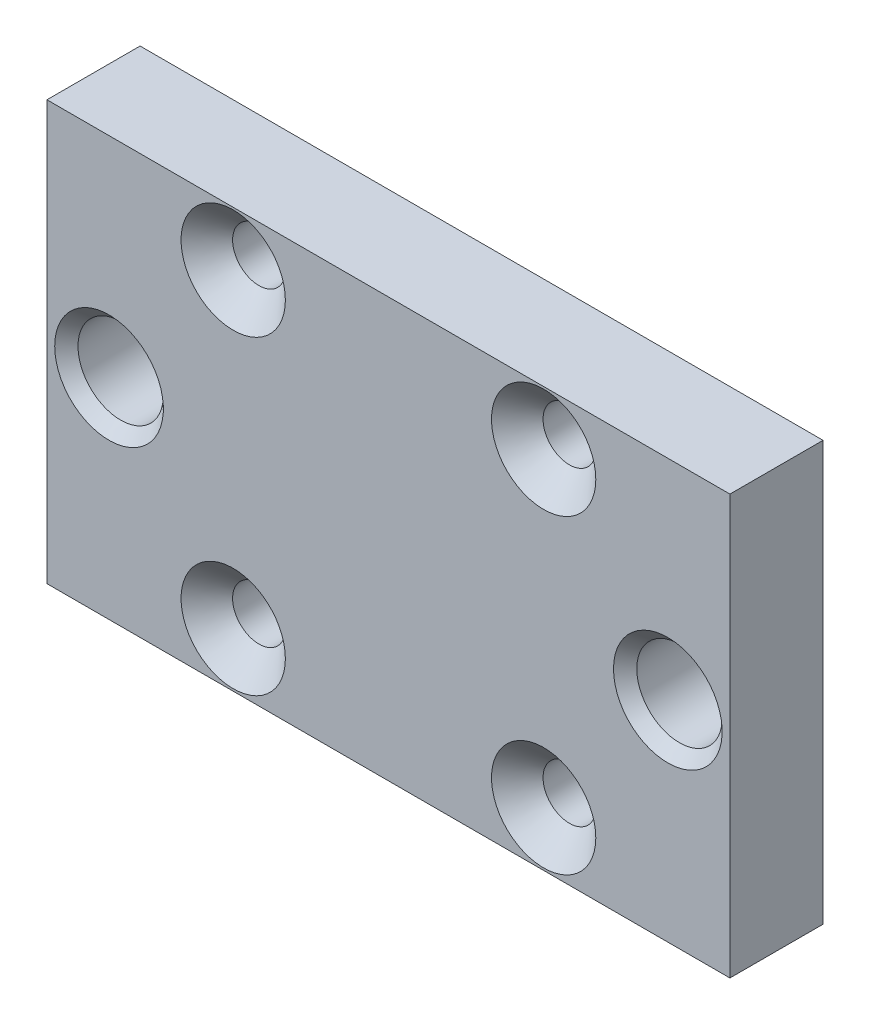
ISO-10303-21;
HEADER;
FILE_DESCRIPTION(('STEP AP214'),'2;1');
FILE_NAME('part.step','',(''),(''),'','','');
FILE_SCHEMA(('AUTOMOTIVE_DESIGN { 1 0 10303 214 1 1 1 1 }'));
ENDSEC;
DATA;
#1=APPLICATION_CONTEXT('core data for automotive mechanical design processes');
#2=APPLICATION_PROTOCOL_DEFINITION('international standard','automotive_design',2000,#1);
#3=PRODUCT_CONTEXT('',#1,'mechanical');
#4=PRODUCT('Part','Part','',(#3));
#5=PRODUCT_RELATED_PRODUCT_CATEGORY('part','',(#4));
#6=PRODUCT_DEFINITION_FORMATION('','',#4);
#7=PRODUCT_DEFINITION_CONTEXT('part definition',#1,'design');
#8=PRODUCT_DEFINITION('design','',#6,#7);
#9=PRODUCT_DEFINITION_SHAPE('','',#8);
#10=(LENGTH_UNIT() NAMED_UNIT(*) SI_UNIT(.MILLI.,.METRE.));
#11=(NAMED_UNIT(*) PLANE_ANGLE_UNIT() SI_UNIT($,.RADIAN.));
#12=(NAMED_UNIT(*) SI_UNIT($,.STERADIAN.) SOLID_ANGLE_UNIT());
#13=UNCERTAINTY_MEASURE_WITH_UNIT(LENGTH_MEASURE(1.E-05),#10,'distance_accuracy_value','');
#14=(GEOMETRIC_REPRESENTATION_CONTEXT(3) GLOBAL_UNCERTAINTY_ASSIGNED_CONTEXT((#13)) GLOBAL_UNIT_ASSIGNED_CONTEXT((#10,
#11,#12)) REPRESENTATION_CONTEXT('',''));
#15=CARTESIAN_POINT('',(0.,0.,0.));
#16=DIRECTION('',(0.,0.,1.));
#17=DIRECTION('',(1.,0.,0.));
#18=AXIS2_PLACEMENT_3D('',#15,#16,#17);
#19=CARTESIAN_POINT('',(0.,0.,6.));
#20=DIRECTION('',(0.,0.,-1.));
#21=DIRECTION('',(-1.,0.,0.));
#22=AXIS2_PLACEMENT_3D('',#19,#20,#21);
#23=PLANE('',#22);
#24=CARTESIAN_POINT('',(18.,0.,6.));
#25=DIRECTION('',(0.,0.,-1.));
#26=DIRECTION('',(-1.,0.,0.));
#27=AXIS2_PLACEMENT_3D('',#24,#25,#26);
#28=CIRCLE('',#27,3.5);
#29=CARTESIAN_POINT('',(14.5,0.,6.));
#30=VERTEX_POINT('',#29);
#31=EDGE_CURVE('E43',#30,#30,#28,.T.);
#32=ORIENTED_EDGE('',*,*,#31,.T.);
#33=EDGE_LOOP('',(#32));
#34=FACE_BOUND('',#33,.T.);
#35=CARTESIAN_POINT('',(-18.,0.,6.));
#36=DIRECTION('',(0.,0.,-1.));
#37=DIRECTION('',(-1.,0.,0.));
#38=AXIS2_PLACEMENT_3D('',#35,#36,#37);
#39=CIRCLE('',#38,3.5);
#40=CARTESIAN_POINT('',(-21.5,0.,6.));
#41=VERTEX_POINT('',#40);
#42=EDGE_CURVE('E114',#41,#41,#39,.T.);
#43=ORIENTED_EDGE('',*,*,#42,.T.);
#44=EDGE_LOOP('',(#43));
#45=FACE_BOUND('',#44,.T.);
#46=CARTESIAN_POINT('',(-10.,10.,6.));
#47=DIRECTION('',(0.,0.,1.));
#48=DIRECTION('',(1.,0.,0.));
#49=AXIS2_PLACEMENT_3D('',#46,#47,#48);
#50=CIRCLE('',#49,3.36);
#51=CARTESIAN_POINT('',(-6.64,10.,6.));
#52=VERTEX_POINT('',#51);
#53=EDGE_CURVE('E174',#52,#52,#50,.T.);
#54=ORIENTED_EDGE('',*,*,#53,.F.);
#55=EDGE_LOOP('',(#54));
#56=FACE_BOUND('',#55,.T.);
#57=CARTESIAN_POINT('',(10.,10.,6.));
#58=DIRECTION('',(0.,0.,1.));
#59=DIRECTION('',(1.,0.,0.));
#60=AXIS2_PLACEMENT_3D('',#57,#58,#59);
#61=CIRCLE('',#60,3.36);
#62=CARTESIAN_POINT('',(13.36,10.,6.));
#63=VERTEX_POINT('',#62);
#64=EDGE_CURVE('E165',#63,#63,#61,.T.);
#65=ORIENTED_EDGE('',*,*,#64,.F.);
#66=EDGE_LOOP('',(#65));
#67=FACE_BOUND('',#66,.T.);
#68=CARTESIAN_POINT('',(10.,-9.99999999999999,6.));
#69=DIRECTION('',(0.,0.,1.));
#70=DIRECTION('',(1.,0.,0.));
#71=AXIS2_PLACEMENT_3D('',#68,#69,#70);
#72=CIRCLE('',#71,3.36);
#73=CARTESIAN_POINT('',(13.36,-9.99999999999999,6.));
#74=VERTEX_POINT('',#73);
#75=EDGE_CURVE('E156',#74,#74,#72,.T.);
#76=ORIENTED_EDGE('',*,*,#75,.F.);
#77=EDGE_LOOP('',(#76));
#78=FACE_BOUND('',#77,.T.);
#79=CARTESIAN_POINT('',(-10.,-10.,6.));
#80=DIRECTION('',(0.,0.,1.));
#81=DIRECTION('',(1.,0.,0.));
#82=AXIS2_PLACEMENT_3D('',#79,#80,#81);
#83=CIRCLE('',#82,3.36);
#84=CARTESIAN_POINT('',(-6.64,-10.,6.));
#85=VERTEX_POINT('',#84);
#86=EDGE_CURVE('E147',#85,#85,#83,.T.);
#87=ORIENTED_EDGE('',*,*,#86,.F.);
#88=EDGE_LOOP('',(#87));
#89=FACE_BOUND('',#88,.T.);
#90=DIRECTION('',(0.,-1.,0.));
#91=VECTOR('',#90,1.);
#92=CARTESIAN_POINT('',(-22.,13.5,6.));
#93=LINE('',#92,#91);
#94=CARTESIAN_POINT('',(-22.,13.5,6.));
#95=VERTEX_POINT('',#94);
#96=CARTESIAN_POINT('',(-22.,-13.5,6.));
#97=VERTEX_POINT('',#96);
#98=EDGE_CURVE('E86',#95,#97,#93,.T.);
#99=ORIENTED_EDGE('',*,*,#98,.T.);
#100=DIRECTION('',(1.,0.,0.));
#101=VECTOR('',#100,1.);
#102=CARTESIAN_POINT('',(22.,-13.5,6.));
#103=LINE('',#102,#101);
#104=CARTESIAN_POINT('',(22.,-13.5,6.));
#105=VERTEX_POINT('',#104);
#106=EDGE_CURVE('E82',#97,#105,#103,.T.);
#107=ORIENTED_EDGE('',*,*,#106,.T.);
#108=DIRECTION('',(0.,1.,0.));
#109=VECTOR('',#108,1.);
#110=CARTESIAN_POINT('',(22.,13.5,6.));
#111=LINE('',#110,#109);
#112=CARTESIAN_POINT('',(22.,13.5,6.));
#113=VERTEX_POINT('',#112);
#114=EDGE_CURVE('E84',#105,#113,#111,.T.);
#115=ORIENTED_EDGE('',*,*,#114,.T.);
#116=DIRECTION('',(-1.,0.,0.));
#117=VECTOR('',#116,1.);
#118=CARTESIAN_POINT('',(22.,13.5,6.));
#119=LINE('',#118,#117);
#120=EDGE_CURVE('E51',#113,#95,#119,.T.);
#121=ORIENTED_EDGE('',*,*,#120,.T.);
#122=EDGE_LOOP('',(#99,#107,#115,#121));
#123=FACE_BOUND('',#122,.T.);
#124=ADVANCED_FACE('F34',(#34,#45,#56,#67,#78,#89,#123),#23,.F.);
#125=CARTESIAN_POINT('',(0.,0.,0.));
#126=DIRECTION('',(0.,0.,-1.));
#127=DIRECTION('',(-1.,0.,0.));
#128=AXIS2_PLACEMENT_3D('',#125,#126,#127);
#129=PLANE('',#128);
#130=CARTESIAN_POINT('',(-10.,10.,0.));
#131=DIRECTION('',(0.,0.,1.));
#132=DIRECTION('',(1.,0.,0.));
#133=AXIS2_PLACEMENT_3D('',#130,#131,#132);
#134=CIRCLE('',#133,1.7);
#135=CARTESIAN_POINT('',(-8.30000000000001,10.,0.));
#136=VERTEX_POINT('',#135);
#137=EDGE_CURVE('E168',#136,#136,#134,.T.);
#138=ORIENTED_EDGE('',*,*,#137,.T.);
#139=EDGE_LOOP('',(#138));
#140=FACE_BOUND('',#139,.T.);
#141=CARTESIAN_POINT('',(10.,10.,0.));
#142=DIRECTION('',(0.,0.,1.));
#143=DIRECTION('',(1.,0.,0.));
#144=AXIS2_PLACEMENT_3D('',#141,#142,#143);
#145=CIRCLE('',#144,1.7);
#146=CARTESIAN_POINT('',(11.7,10.,0.));
#147=VERTEX_POINT('',#146);
#148=EDGE_CURVE('E159',#147,#147,#145,.T.);
#149=ORIENTED_EDGE('',*,*,#148,.T.);
#150=EDGE_LOOP('',(#149));
#151=FACE_BOUND('',#150,.T.);
#152=CARTESIAN_POINT('',(10.,-9.99999999999999,0.));
#153=DIRECTION('',(0.,0.,1.));
#154=DIRECTION('',(1.,0.,0.));
#155=AXIS2_PLACEMENT_3D('',#152,#153,#154);
#156=CIRCLE('',#155,1.7);
#157=CARTESIAN_POINT('',(11.7,-9.99999999999999,0.));
#158=VERTEX_POINT('',#157);
#159=EDGE_CURVE('E150',#158,#158,#156,.T.);
#160=ORIENTED_EDGE('',*,*,#159,.T.);
#161=EDGE_LOOP('',(#160));
#162=FACE_BOUND('',#161,.T.);
#163=CARTESIAN_POINT('',(-10.,-10.,0.));
#164=DIRECTION('',(0.,0.,1.));
#165=DIRECTION('',(1.,0.,0.));
#166=AXIS2_PLACEMENT_3D('',#163,#164,#165);
#167=CIRCLE('',#166,1.7);
#168=CARTESIAN_POINT('',(-8.3,-10.,0.));
#169=VERTEX_POINT('',#168);
#170=EDGE_CURVE('E137',#169,#169,#167,.T.);
#171=ORIENTED_EDGE('',*,*,#170,.T.);
#172=EDGE_LOOP('',(#171));
#173=FACE_BOUND('',#172,.T.);
#174=CARTESIAN_POINT('',(-18.,0.,0.));
#175=DIRECTION('',(0.,0.,1.));
#176=DIRECTION('',(1.,0.,0.));
#177=AXIS2_PLACEMENT_3D('',#174,#175,#176);
#178=CIRCLE('',#177,2.75);
#179=CARTESIAN_POINT('',(-15.25,0.,0.));
#180=VERTEX_POINT('',#179);
#181=EDGE_CURVE('E104',#180,#180,#178,.T.);
#182=ORIENTED_EDGE('',*,*,#181,.T.);
#183=EDGE_LOOP('',(#182));
#184=FACE_BOUND('',#183,.T.);
#185=DIRECTION('',(0.,-1.,0.));
#186=VECTOR('',#185,1.);
#187=CARTESIAN_POINT('',(-22.,13.5,0.));
#188=LINE('',#187,#186);
#189=CARTESIAN_POINT('',(-22.,13.5,0.));
#190=VERTEX_POINT('',#189);
#191=CARTESIAN_POINT('',(-22.,-13.5,0.));
#192=VERTEX_POINT('',#191);
#193=EDGE_CURVE('E101',#190,#192,#188,.T.);
#194=ORIENTED_EDGE('',*,*,#193,.F.);
#195=DIRECTION('',(-1.,0.,0.));
#196=VECTOR('',#195,1.);
#197=CARTESIAN_POINT('',(22.,13.5,0.));
#198=LINE('',#197,#196);
#199=CARTESIAN_POINT('',(22.,13.5,0.));
#200=VERTEX_POINT('',#199);
#201=EDGE_CURVE('E74',#200,#190,#198,.T.);
#202=ORIENTED_EDGE('',*,*,#201,.F.);
#203=DIRECTION('',(0.,1.,0.));
#204=VECTOR('',#203,1.);
#205=CARTESIAN_POINT('',(22.,13.5,0.));
#206=LINE('',#205,#204);
#207=CARTESIAN_POINT('',(22.,-13.5,0.));
#208=VERTEX_POINT('',#207);
#209=EDGE_CURVE('E68',#208,#200,#206,.T.);
#210=ORIENTED_EDGE('',*,*,#209,.F.);
#211=DIRECTION('',(1.,0.,0.));
#212=VECTOR('',#211,1.);
#213=CARTESIAN_POINT('',(22.,-13.5,0.));
#214=LINE('',#213,#212);
#215=EDGE_CURVE('E91',#192,#208,#214,.T.);
#216=ORIENTED_EDGE('',*,*,#215,.F.);
#217=EDGE_LOOP('',(#194,#202,#210,#216));
#218=FACE_BOUND('',#217,.T.);
#219=CARTESIAN_POINT('',(18.,0.,0.));
#220=DIRECTION('',(0.,0.,1.));
#221=DIRECTION('',(1.,0.,0.));
#222=AXIS2_PLACEMENT_3D('',#219,#220,#221);
#223=CIRCLE('',#222,2.75);
#224=CARTESIAN_POINT('',(20.75,0.,0.));
#225=VERTEX_POINT('',#224);
#226=EDGE_CURVE('E135',#225,#225,#223,.T.);
#227=ORIENTED_EDGE('',*,*,#226,.T.);
#228=EDGE_LOOP('',(#227));
#229=FACE_BOUND('',#228,.T.);
#230=ADVANCED_FACE('F181',(#140,#151,#162,#173,#184,#218,#229),#129,.T.);
#231=CARTESIAN_POINT('',(-22.,13.5,6.));
#232=DIRECTION('',(1.,0.,0.));
#233=DIRECTION('',(0.,1.,0.));
#234=AXIS2_PLACEMENT_3D('',#231,#232,#233);
#235=PLANE('',#234);
#236=ORIENTED_EDGE('',*,*,#193,.T.);
#237=DIRECTION('',(0.,0.,-1.));
#238=VECTOR('',#237,1.);
#239=CARTESIAN_POINT('',(-22.,-13.5,6.));
#240=LINE('',#239,#238);
#241=EDGE_CURVE('E92',#97,#192,#240,.T.);
#242=ORIENTED_EDGE('',*,*,#241,.F.);
#243=ORIENTED_EDGE('',*,*,#98,.F.);
#244=DIRECTION('',(0.,0.,-1.));
#245=VECTOR('',#244,1.);
#246=CARTESIAN_POINT('',(-22.,13.5,6.));
#247=LINE('',#246,#245);
#248=EDGE_CURVE('E97',#95,#190,#247,.T.);
#249=ORIENTED_EDGE('',*,*,#248,.T.);
#250=EDGE_LOOP('',(#236,#242,#243,#249));
#251=FACE_BOUND('',#250,.T.);
#252=ADVANCED_FACE('F212',(#251),#235,.F.);
#253=CARTESIAN_POINT('',(22.,-13.5,6.));
#254=DIRECTION('',(0.,1.,0.));
#255=DIRECTION('',(-1.,0.,0.));
#256=AXIS2_PLACEMENT_3D('',#253,#254,#255);
#257=PLANE('',#256);
#258=ORIENTED_EDGE('',*,*,#215,.T.);
#259=DIRECTION('',(0.,0.,-1.));
#260=VECTOR('',#259,1.);
#261=CARTESIAN_POINT('',(22.,-13.5,6.));
#262=LINE('',#261,#260);
#263=EDGE_CURVE('E89',#105,#208,#262,.T.);
#264=ORIENTED_EDGE('',*,*,#263,.F.);
#265=ORIENTED_EDGE('',*,*,#106,.F.);
#266=ORIENTED_EDGE('',*,*,#241,.T.);
#267=EDGE_LOOP('',(#258,#264,#265,#266));
#268=FACE_BOUND('',#267,.T.);
#269=ADVANCED_FACE('F90',(#268),#257,.F.);
#270=CARTESIAN_POINT('',(22.,13.5,6.));
#271=DIRECTION('',(-1.,0.,0.));
#272=DIRECTION('',(0.,0.,1.));
#273=AXIS2_PLACEMENT_3D('',#270,#271,#272);
#274=PLANE('',#273);
#275=ORIENTED_EDGE('',*,*,#209,.T.);
#276=DIRECTION('',(0.,0.,-1.));
#277=VECTOR('',#276,1.);
#278=CARTESIAN_POINT('',(22.,13.5,6.));
#279=LINE('',#278,#277);
#280=EDGE_CURVE('E93',#113,#200,#279,.T.);
#281=ORIENTED_EDGE('',*,*,#280,.F.);
#282=ORIENTED_EDGE('',*,*,#114,.F.);
#283=ORIENTED_EDGE('',*,*,#263,.T.);
#284=EDGE_LOOP('',(#275,#281,#282,#283));
#285=FACE_BOUND('',#284,.T.);
#286=ADVANCED_FACE('F95',(#285),#274,.F.);
#287=CARTESIAN_POINT('',(22.,13.5,6.));
#288=DIRECTION('',(0.,-1.,0.));
#289=DIRECTION('',(1.,0.,0.));
#290=AXIS2_PLACEMENT_3D('',#287,#288,#289);
#291=PLANE('',#290);
#292=ORIENTED_EDGE('',*,*,#201,.T.);
#293=ORIENTED_EDGE('',*,*,#248,.F.);
#294=ORIENTED_EDGE('',*,*,#120,.F.);
#295=ORIENTED_EDGE('',*,*,#280,.T.);
#296=EDGE_LOOP('',(#292,#293,#294,#295));
#297=FACE_BOUND('',#296,.T.);
#298=ADVANCED_FACE('F207',(#297),#291,.F.);
#299=CARTESIAN_POINT('',(-18.,0.,6.));
#300=DIRECTION('',(0.,0.,-1.));
#301=DIRECTION('',(-1.,0.,0.));
#302=AXIS2_PLACEMENT_3D('',#299,#300,#301);
#303=CYLINDRICAL_SURFACE('',#302,2.75);
#304=CARTESIAN_POINT('',(-18.,0.,5.25));
#305=DIRECTION('',(0.,0.,-1.));
#306=DIRECTION('',(-1.,0.,0.));
#307=AXIS2_PLACEMENT_3D('',#304,#305,#306);
#308=CIRCLE('',#307,2.75);
#309=CARTESIAN_POINT('',(-20.75,0.,5.25));
#310=VERTEX_POINT('',#309);
#311=EDGE_CURVE('E11',#310,#310,#308,.F.);
#312=ORIENTED_EDGE('',*,*,#311,.T.);
#313=EDGE_LOOP('',(#312));
#314=FACE_BOUND('',#313,.T.);
#315=ORIENTED_EDGE('',*,*,#181,.F.);
#316=EDGE_LOOP('',(#315));
#317=FACE_BOUND('',#316,.T.);
#318=ADVANCED_FACE('F131',(#314,#317),#303,.F.);
#319=CARTESIAN_POINT('',(18.,0.,6.));
#320=DIRECTION('',(0.,0.,-1.));
#321=DIRECTION('',(-1.,0.,0.));
#322=AXIS2_PLACEMENT_3D('',#319,#320,#321);
#323=CYLINDRICAL_SURFACE('',#322,2.75);
#324=CARTESIAN_POINT('',(18.,0.,5.25));
#325=DIRECTION('',(0.,0.,-1.));
#326=DIRECTION('',(-1.,0.,0.));
#327=AXIS2_PLACEMENT_3D('',#324,#325,#326);
#328=CIRCLE('',#327,2.75);
#329=CARTESIAN_POINT('',(15.25,0.,5.25));
#330=VERTEX_POINT('',#329);
#331=EDGE_CURVE('E111',#330,#330,#328,.F.);
#332=ORIENTED_EDGE('',*,*,#331,.T.);
#333=EDGE_LOOP('',(#332));
#334=FACE_BOUND('',#333,.T.);
#335=ORIENTED_EDGE('',*,*,#226,.F.);
#336=EDGE_LOOP('',(#335));
#337=FACE_BOUND('',#336,.T.);
#338=ADVANCED_FACE('F127',(#334,#337),#323,.F.);
#339=CARTESIAN_POINT('',(-10.,-10.,6.));
#340=DIRECTION('',(0.,0.,1.));
#341=DIRECTION('',(1.,0.,0.));
#342=AXIS2_PLACEMENT_3D('',#339,#340,#341);
#343=CYLINDRICAL_SURFACE('',#342,1.7);
#344=ORIENTED_EDGE('',*,*,#170,.F.);
#345=EDGE_LOOP('',(#344));
#346=FACE_BOUND('',#345,.T.);
#347=CARTESIAN_POINT('',(-10.,-10.,4.34));
#348=DIRECTION('',(0.,0.,1.));
#349=DIRECTION('',(1.,0.,0.));
#350=AXIS2_PLACEMENT_3D('',#347,#348,#349);
#351=CIRCLE('',#350,1.7);
#352=CARTESIAN_POINT('',(-8.3,-10.,4.34));
#353=VERTEX_POINT('',#352);
#354=EDGE_CURVE('E142',#353,#353,#351,.T.);
#355=ORIENTED_EDGE('',*,*,#354,.T.);
#356=EDGE_LOOP('',(#355));
#357=FACE_BOUND('',#356,.T.);
#358=ADVANCED_FACE('F130',(#346,#357),#343,.F.);
#359=CARTESIAN_POINT('',(-10.,-10.,6.));
#360=DIRECTION('',(0.,0.,1.));
#361=DIRECTION('',(1.,0.,0.));
#362=AXIS2_PLACEMENT_3D('',#359,#360,#361);
#363=CONICAL_SURFACE('',#362,3.36,0.785398163397449);
#364=ORIENTED_EDGE('',*,*,#354,.F.);
#365=EDGE_LOOP('',(#364));
#366=FACE_BOUND('',#365,.T.);
#367=ORIENTED_EDGE('',*,*,#86,.T.);
#368=EDGE_LOOP('',(#367));
#369=FACE_BOUND('',#368,.T.);
#370=ADVANCED_FACE('F189',(#366,#369),#363,.F.);
#371=CARTESIAN_POINT('',(10.,-9.99999999999999,6.));
#372=DIRECTION('',(0.,0.,1.));
#373=DIRECTION('',(1.,0.,0.));
#374=AXIS2_PLACEMENT_3D('',#371,#372,#373);
#375=CYLINDRICAL_SURFACE('',#374,1.7);
#376=ORIENTED_EDGE('',*,*,#159,.F.);
#377=EDGE_LOOP('',(#376));
#378=FACE_BOUND('',#377,.T.);
#379=CARTESIAN_POINT('',(10.,-9.99999999999999,4.34));
#380=DIRECTION('',(0.,0.,1.));
#381=DIRECTION('',(1.,0.,0.));
#382=AXIS2_PLACEMENT_3D('',#379,#380,#381);
#383=CIRCLE('',#382,1.7);
#384=CARTESIAN_POINT('',(11.7,-9.99999999999999,4.34));
#385=VERTEX_POINT('',#384);
#386=EDGE_CURVE('E153',#385,#385,#383,.T.);
#387=ORIENTED_EDGE('',*,*,#386,.T.);
#388=EDGE_LOOP('',(#387));
#389=FACE_BOUND('',#388,.T.);
#390=ADVANCED_FACE('F191',(#378,#389),#375,.F.);
#391=CARTESIAN_POINT('',(10.,-9.99999999999999,6.));
#392=DIRECTION('',(0.,0.,1.));
#393=DIRECTION('',(1.,0.,0.));
#394=AXIS2_PLACEMENT_3D('',#391,#392,#393);
#395=CONICAL_SURFACE('',#394,3.36,0.785398163397449);
#396=ORIENTED_EDGE('',*,*,#386,.F.);
#397=EDGE_LOOP('',(#396));
#398=FACE_BOUND('',#397,.T.);
#399=ORIENTED_EDGE('',*,*,#75,.T.);
#400=EDGE_LOOP('',(#399));
#401=FACE_BOUND('',#400,.T.);
#402=ADVANCED_FACE('F198',(#398,#401),#395,.F.);
#403=CARTESIAN_POINT('',(10.,10.,6.));
#404=DIRECTION('',(0.,0.,1.));
#405=DIRECTION('',(1.,0.,0.));
#406=AXIS2_PLACEMENT_3D('',#403,#404,#405);
#407=CYLINDRICAL_SURFACE('',#406,1.7);
#408=ORIENTED_EDGE('',*,*,#148,.F.);
#409=EDGE_LOOP('',(#408));
#410=FACE_BOUND('',#409,.T.);
#411=CARTESIAN_POINT('',(10.,10.,4.34));
#412=DIRECTION('',(0.,0.,1.));
#413=DIRECTION('',(1.,0.,0.));
#414=AXIS2_PLACEMENT_3D('',#411,#412,#413);
#415=CIRCLE('',#414,1.7);
#416=CARTESIAN_POINT('',(11.7,10.,4.34));
#417=VERTEX_POINT('',#416);
#418=EDGE_CURVE('E162',#417,#417,#415,.T.);
#419=ORIENTED_EDGE('',*,*,#418,.T.);
#420=EDGE_LOOP('',(#419));
#421=FACE_BOUND('',#420,.T.);
#422=ADVANCED_FACE('F275',(#410,#421),#407,.F.);
#423=CARTESIAN_POINT('',(10.,10.,6.));
#424=DIRECTION('',(0.,0.,1.));
#425=DIRECTION('',(1.,0.,0.));
#426=AXIS2_PLACEMENT_3D('',#423,#424,#425);
#427=CONICAL_SURFACE('',#426,3.36,0.785398163397449);
#428=ORIENTED_EDGE('',*,*,#418,.F.);
#429=EDGE_LOOP('',(#428));
#430=FACE_BOUND('',#429,.T.);
#431=ORIENTED_EDGE('',*,*,#64,.T.);
#432=EDGE_LOOP('',(#431));
#433=FACE_BOUND('',#432,.T.);
#434=ADVANCED_FACE('F284',(#430,#433),#427,.F.);
#435=CARTESIAN_POINT('',(-10.,10.,6.));
#436=DIRECTION('',(0.,0.,1.));
#437=DIRECTION('',(1.,0.,0.));
#438=AXIS2_PLACEMENT_3D('',#435,#436,#437);
#439=CYLINDRICAL_SURFACE('',#438,1.7);
#440=ORIENTED_EDGE('',*,*,#137,.F.);
#441=EDGE_LOOP('',(#440));
#442=FACE_BOUND('',#441,.T.);
#443=CARTESIAN_POINT('',(-10.,10.,4.34));
#444=DIRECTION('',(0.,0.,1.));
#445=DIRECTION('',(1.,0.,0.));
#446=AXIS2_PLACEMENT_3D('',#443,#444,#445);
#447=CIRCLE('',#446,1.7);
#448=CARTESIAN_POINT('',(-8.30000000000001,10.,4.34));
#449=VERTEX_POINT('',#448);
#450=EDGE_CURVE('E171',#449,#449,#447,.T.);
#451=ORIENTED_EDGE('',*,*,#450,.T.);
#452=EDGE_LOOP('',(#451));
#453=FACE_BOUND('',#452,.T.);
#454=ADVANCED_FACE('F294',(#442,#453),#439,.F.);
#455=CARTESIAN_POINT('',(-10.,10.,6.));
#456=DIRECTION('',(0.,0.,1.));
#457=DIRECTION('',(1.,0.,0.));
#458=AXIS2_PLACEMENT_3D('',#455,#456,#457);
#459=CONICAL_SURFACE('',#458,3.36,0.785398163397449);
#460=ORIENTED_EDGE('',*,*,#450,.F.);
#461=EDGE_LOOP('',(#460));
#462=FACE_BOUND('',#461,.T.);
#463=ORIENTED_EDGE('',*,*,#53,.T.);
#464=EDGE_LOOP('',(#463));
#465=FACE_BOUND('',#464,.T.);
#466=ADVANCED_FACE('F124',(#462,#465),#459,.F.);
#467=CARTESIAN_POINT('',(18.,0.,5.25));
#468=DIRECTION('',(0.,0.,1.));
#469=DIRECTION('',(1.,0.,0.));
#470=AXIS2_PLACEMENT_3D('',#467,#468,#469);
#471=CONICAL_SURFACE('',#470,2.75,0.785398163397451);
#472=ORIENTED_EDGE('',*,*,#31,.F.);
#473=EDGE_LOOP('',(#472));
#474=FACE_BOUND('',#473,.T.);
#475=ORIENTED_EDGE('',*,*,#331,.F.);
#476=EDGE_LOOP('',(#475));
#477=FACE_BOUND('',#476,.T.);
#478=ADVANCED_FACE('F121',(#474,#477),#471,.F.);
#479=CARTESIAN_POINT('',(-18.,0.,5.25));
#480=DIRECTION('',(0.,0.,1.));
#481=DIRECTION('',(1.,0.,0.));
#482=AXIS2_PLACEMENT_3D('',#479,#480,#481);
#483=CONICAL_SURFACE('',#482,2.75,0.785398163397451);
#484=ORIENTED_EDGE('',*,*,#42,.F.);
#485=EDGE_LOOP('',(#484));
#486=FACE_BOUND('',#485,.T.);
#487=ORIENTED_EDGE('',*,*,#311,.F.);
#488=EDGE_LOOP('',(#487));
#489=FACE_BOUND('',#488,.T.);
#490=ADVANCED_FACE('F36',(#486,#489),#483,.F.);
#491=CLOSED_SHELL('',(#124,#230,#252,#269,#286,#298,#318,#338,#358,#370,#390,#402,#422,#434,
#454,#466,#478,#490));
#492=MANIFOLD_SOLID_BREP('B2',#491);
#493=ADVANCED_BREP_SHAPE_REPRESENTATION('',(#18,#492),#14);
#494=SHAPE_DEFINITION_REPRESENTATION(#9,#493);
ENDSEC;
END-ISO-10303-21;
